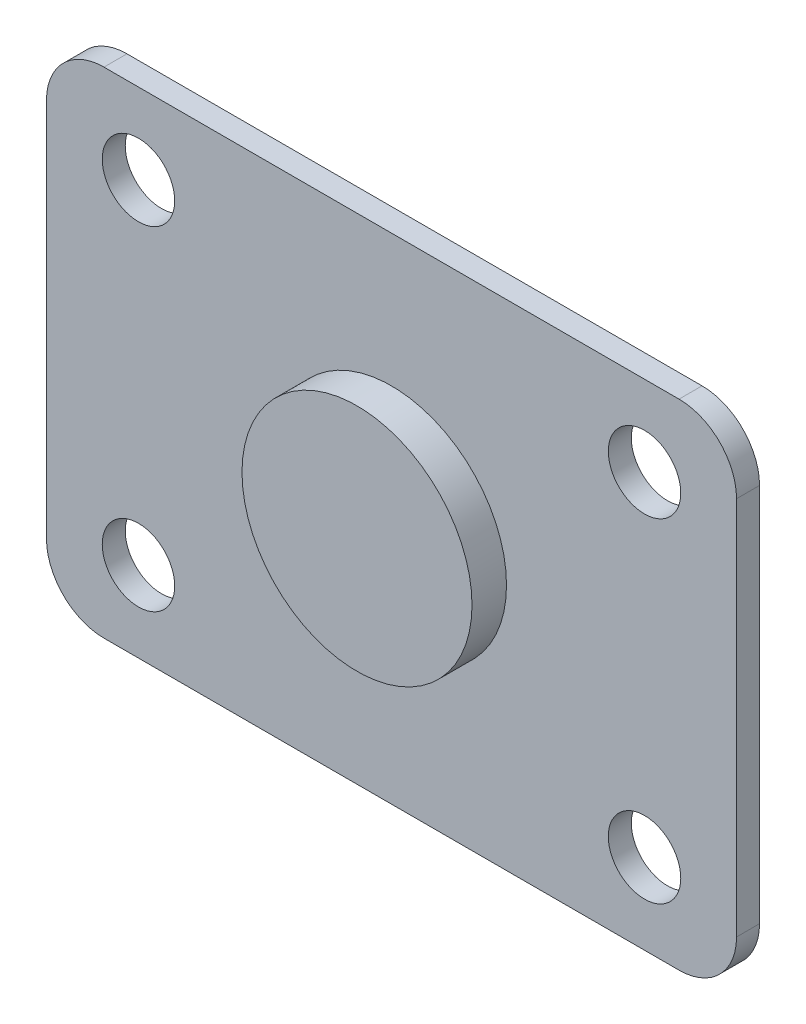
ISO-10303-21;
HEADER;
FILE_DESCRIPTION(('STEP AP214'),'2;1');
FILE_NAME('part.step','',(''),(''),'','','');
FILE_SCHEMA(('AUTOMOTIVE_DESIGN { 1 0 10303 214 1 1 1 1 }'));
ENDSEC;
DATA;
#1=APPLICATION_CONTEXT('core data for automotive mechanical design processes');
#2=APPLICATION_PROTOCOL_DEFINITION('international standard','automotive_design',2000,#1);
#3=PRODUCT_CONTEXT('',#1,'mechanical');
#4=PRODUCT('Part','Part','',(#3));
#5=PRODUCT_RELATED_PRODUCT_CATEGORY('part','',(#4));
#6=PRODUCT_DEFINITION_FORMATION('','',#4);
#7=PRODUCT_DEFINITION_CONTEXT('part definition',#1,'design');
#8=PRODUCT_DEFINITION('design','',#6,#7);
#9=PRODUCT_DEFINITION_SHAPE('','',#8);
#10=(LENGTH_UNIT() NAMED_UNIT(*) SI_UNIT(.MILLI.,.METRE.));
#11=(NAMED_UNIT(*) PLANE_ANGLE_UNIT() SI_UNIT($,.RADIAN.));
#12=(NAMED_UNIT(*) SI_UNIT($,.STERADIAN.) SOLID_ANGLE_UNIT());
#13=UNCERTAINTY_MEASURE_WITH_UNIT(LENGTH_MEASURE(1.E-05),#10,'distance_accuracy_value','');
#14=(GEOMETRIC_REPRESENTATION_CONTEXT(3) GLOBAL_UNCERTAINTY_ASSIGNED_CONTEXT((#13)) GLOBAL_UNIT_ASSIGNED_CONTEXT((#10,
#11,#12)) REPRESENTATION_CONTEXT('',''));
#15=CARTESIAN_POINT('',(0.,0.,0.));
#16=DIRECTION('',(0.,0.,1.));
#17=DIRECTION('',(1.,0.,0.));
#18=AXIS2_PLACEMENT_3D('',#15,#16,#17);
#19=CARTESIAN_POINT('',(-30.,21.5,2.));
#20=DIRECTION('',(1.,0.,0.));
#21=DIRECTION('',(0.,1.,0.));
#22=AXIS2_PLACEMENT_3D('',#19,#20,#21);
#23=PLANE('',#22);
#24=DIRECTION('',(0.,-1.,0.));
#25=VECTOR('',#24,1.);
#26=CARTESIAN_POINT('',(-30.,21.5,0.));
#27=LINE('',#26,#25);
#28=CARTESIAN_POINT('',(-30.,16.5,0.));
#29=VERTEX_POINT('',#28);
#30=CARTESIAN_POINT('',(-30.,-16.5,0.));
#31=VERTEX_POINT('',#30);
#32=EDGE_CURVE('E130',#29,#31,#27,.T.);
#33=ORIENTED_EDGE('',*,*,#32,.T.);
#34=DIRECTION('',(0.,0.,-1.));
#35=VECTOR('',#34,1.);
#36=CARTESIAN_POINT('',(-30.,-16.5,2.));
#37=LINE('',#36,#35);
#38=CARTESIAN_POINT('',(-30.,-16.5,2.));
#39=VERTEX_POINT('',#38);
#40=EDGE_CURVE('E107',#31,#39,#37,.F.);
#41=ORIENTED_EDGE('',*,*,#40,.T.);
#42=DIRECTION('',(0.,-1.,0.));
#43=VECTOR('',#42,1.);
#44=CARTESIAN_POINT('',(-30.,21.5,2.));
#45=LINE('',#44,#43);
#46=CARTESIAN_POINT('',(-30.,16.5,2.));
#47=VERTEX_POINT('',#46);
#48=EDGE_CURVE('E140',#47,#39,#45,.T.);
#49=ORIENTED_EDGE('',*,*,#48,.F.);
#50=DIRECTION('',(0.,0.,-1.));
#51=VECTOR('',#50,1.);
#52=CARTESIAN_POINT('',(-30.,16.5,2.));
#53=LINE('',#52,#51);
#54=EDGE_CURVE('E112',#47,#29,#53,.T.);
#55=ORIENTED_EDGE('',*,*,#54,.T.);
#56=EDGE_LOOP('',(#33,#41,#49,#55));
#57=FACE_BOUND('',#56,.T.);
#58=ADVANCED_FACE('F35',(#57),#23,.F.);
#59=CARTESIAN_POINT('',(-30.,-21.5,2.));
#60=DIRECTION('',(0.,1.,0.));
#61=DIRECTION('',(0.,0.,1.));
#62=AXIS2_PLACEMENT_3D('',#59,#60,#61);
#63=PLANE('',#62);
#64=DIRECTION('',(1.,0.,0.));
#65=VECTOR('',#64,1.);
#66=CARTESIAN_POINT('',(-30.,-21.5,2.));
#67=LINE('',#66,#65);
#68=CARTESIAN_POINT('',(-25.,-21.5,2.));
#69=VERTEX_POINT('',#68);
#70=CARTESIAN_POINT('',(25.,-21.5,2.));
#71=VERTEX_POINT('',#70);
#72=EDGE_CURVE('E122',#69,#71,#67,.T.);
#73=ORIENTED_EDGE('',*,*,#72,.F.);
#74=DIRECTION('',(0.,0.,-1.));
#75=VECTOR('',#74,1.);
#76=CARTESIAN_POINT('',(-25.,-21.5,2.));
#77=LINE('',#76,#75);
#78=CARTESIAN_POINT('',(-25.,-21.5,0.));
#79=VERTEX_POINT('',#78);
#80=EDGE_CURVE('E106',#69,#79,#77,.T.);
#81=ORIENTED_EDGE('',*,*,#80,.T.);
#82=DIRECTION('',(1.,0.,0.));
#83=VECTOR('',#82,1.);
#84=CARTESIAN_POINT('',(-30.,-21.5,0.));
#85=LINE('',#84,#83);
#86=CARTESIAN_POINT('',(25.,-21.5,0.));
#87=VERTEX_POINT('',#86);
#88=EDGE_CURVE('E119',#79,#87,#85,.T.);
#89=ORIENTED_EDGE('',*,*,#88,.T.);
#90=DIRECTION('',(0.,0.,-1.));
#91=VECTOR('',#90,1.);
#92=CARTESIAN_POINT('',(25.,-21.5,2.));
#93=LINE('',#92,#91);
#94=EDGE_CURVE('E124',#87,#71,#93,.F.);
#95=ORIENTED_EDGE('',*,*,#94,.T.);
#96=EDGE_LOOP('',(#73,#81,#89,#95));
#97=FACE_BOUND('',#96,.T.);
#98=ADVANCED_FACE('F118',(#97),#63,.F.);
#99=CARTESIAN_POINT('',(30.,21.5,2.));
#100=DIRECTION('',(-1.,0.,0.));
#101=DIRECTION('',(0.,-1.,0.));
#102=AXIS2_PLACEMENT_3D('',#99,#100,#101);
#103=PLANE('',#102);
#104=DIRECTION('',(0.,1.,0.));
#105=VECTOR('',#104,1.);
#106=CARTESIAN_POINT('',(30.,21.5,2.));
#107=LINE('',#106,#105);
#108=CARTESIAN_POINT('',(30.,-16.5,2.));
#109=VERTEX_POINT('',#108);
#110=CARTESIAN_POINT('',(30.,16.5,2.));
#111=VERTEX_POINT('',#110);
#112=EDGE_CURVE('E163',#109,#111,#107,.T.);
#113=ORIENTED_EDGE('',*,*,#112,.F.);
#114=DIRECTION('',(0.,0.,-1.));
#115=VECTOR('',#114,1.);
#116=CARTESIAN_POINT('',(30.,-16.5,2.));
#117=LINE('',#116,#115);
#118=CARTESIAN_POINT('',(30.,-16.5,0.));
#119=VERTEX_POINT('',#118);
#120=EDGE_CURVE('E11',#109,#119,#117,.T.);
#121=ORIENTED_EDGE('',*,*,#120,.T.);
#122=DIRECTION('',(0.,1.,0.));
#123=VECTOR('',#122,1.);
#124=CARTESIAN_POINT('',(30.,21.5,0.));
#125=LINE('',#124,#123);
#126=CARTESIAN_POINT('',(30.,16.5,0.));
#127=VERTEX_POINT('',#126);
#128=EDGE_CURVE('E129',#119,#127,#125,.T.);
#129=ORIENTED_EDGE('',*,*,#128,.T.);
#130=DIRECTION('',(0.,0.,-1.));
#131=VECTOR('',#130,1.);
#132=CARTESIAN_POINT('',(30.,16.5,2.));
#133=LINE('',#132,#131);
#134=EDGE_CURVE('E43',#127,#111,#133,.F.);
#135=ORIENTED_EDGE('',*,*,#134,.T.);
#136=EDGE_LOOP('',(#113,#121,#129,#135));
#137=FACE_BOUND('',#136,.T.);
#138=ADVANCED_FACE('F162',(#137),#103,.F.);
#139=CARTESIAN_POINT('',(-30.,21.5,2.));
#140=DIRECTION('',(0.,-1.,0.));
#141=DIRECTION('',(0.,0.,-1.));
#142=AXIS2_PLACEMENT_3D('',#139,#140,#141);
#143=PLANE('',#142);
#144=DIRECTION('',(-1.,0.,0.));
#145=VECTOR('',#144,1.);
#146=CARTESIAN_POINT('',(-30.,21.5,0.));
#147=LINE('',#146,#145);
#148=CARTESIAN_POINT('',(25.,21.5,0.));
#149=VERTEX_POINT('',#148);
#150=CARTESIAN_POINT('',(-25.,21.5,0.));
#151=VERTEX_POINT('',#150);
#152=EDGE_CURVE('E133',#149,#151,#147,.T.);
#153=ORIENTED_EDGE('',*,*,#152,.T.);
#154=DIRECTION('',(0.,0.,-1.));
#155=VECTOR('',#154,1.);
#156=CARTESIAN_POINT('',(-25.,21.5,2.));
#157=LINE('',#156,#155);
#158=CARTESIAN_POINT('',(-25.,21.5,2.));
#159=VERTEX_POINT('',#158);
#160=EDGE_CURVE('E50',#151,#159,#157,.F.);
#161=ORIENTED_EDGE('',*,*,#160,.T.);
#162=DIRECTION('',(-1.,0.,0.));
#163=VECTOR('',#162,1.);
#164=CARTESIAN_POINT('',(-30.,21.5,2.));
#165=LINE('',#164,#163);
#166=CARTESIAN_POINT('',(25.,21.5,2.));
#167=VERTEX_POINT('',#166);
#168=EDGE_CURVE('E169',#167,#159,#165,.T.);
#169=ORIENTED_EDGE('',*,*,#168,.F.);
#170=DIRECTION('',(0.,0.,-1.));
#171=VECTOR('',#170,1.);
#172=CARTESIAN_POINT('',(25.,21.5,2.));
#173=LINE('',#172,#171);
#174=EDGE_CURVE('E156',#167,#149,#173,.T.);
#175=ORIENTED_EDGE('',*,*,#174,.T.);
#176=EDGE_LOOP('',(#153,#161,#169,#175));
#177=FACE_BOUND('',#176,.T.);
#178=ADVANCED_FACE('F173',(#177),#143,.F.);
#179=CARTESIAN_POINT('',(0.,0.,2.));
#180=DIRECTION('',(0.,0.,1.));
#181=DIRECTION('',(1.,0.,0.));
#182=AXIS2_PLACEMENT_3D('',#179,#180,#181);
#183=PLANE('',#182);
#184=CARTESIAN_POINT('',(-22.,-14.5,2.));
#185=DIRECTION('',(0.,0.,1.));
#186=DIRECTION('',(1.,0.,0.));
#187=AXIS2_PLACEMENT_3D('',#184,#185,#186);
#188=CIRCLE('',#187,3.15);
#189=CARTESIAN_POINT('',(-18.85,-14.5,2.));
#190=VERTEX_POINT('',#189);
#191=EDGE_CURVE('E246',#190,#190,#188,.T.);
#192=ORIENTED_EDGE('',*,*,#191,.F.);
#193=EDGE_LOOP('',(#192));
#194=FACE_BOUND('',#193,.T.);
#195=CARTESIAN_POINT('',(22.,14.5,2.));
#196=DIRECTION('',(0.,0.,1.));
#197=DIRECTION('',(1.,0.,0.));
#198=AXIS2_PLACEMENT_3D('',#195,#196,#197);
#199=CIRCLE('',#198,3.15);
#200=CARTESIAN_POINT('',(25.15,14.5,2.));
#201=VERTEX_POINT('',#200);
#202=EDGE_CURVE('E248',#201,#201,#199,.T.);
#203=ORIENTED_EDGE('',*,*,#202,.F.);
#204=EDGE_LOOP('',(#203));
#205=FACE_BOUND('',#204,.T.);
#206=CARTESIAN_POINT('',(22.,-14.5,2.));
#207=DIRECTION('',(0.,0.,1.));
#208=DIRECTION('',(1.,0.,0.));
#209=AXIS2_PLACEMENT_3D('',#206,#207,#208);
#210=CIRCLE('',#209,3.15);
#211=CARTESIAN_POINT('',(25.15,-14.5,2.));
#212=VERTEX_POINT('',#211);
#213=EDGE_CURVE('E253',#212,#212,#210,.T.);
#214=ORIENTED_EDGE('',*,*,#213,.F.);
#215=EDGE_LOOP('',(#214));
#216=FACE_BOUND('',#215,.T.);
#217=CARTESIAN_POINT('',(-22.,14.5,2.));
#218=DIRECTION('',(0.,0.,1.));
#219=DIRECTION('',(1.,0.,0.));
#220=AXIS2_PLACEMENT_3D('',#217,#218,#219);
#221=CIRCLE('',#220,3.15);
#222=CARTESIAN_POINT('',(-18.85,14.5,2.));
#223=VERTEX_POINT('',#222);
#224=EDGE_CURVE('E256',#223,#223,#221,.T.);
#225=ORIENTED_EDGE('',*,*,#224,.F.);
#226=EDGE_LOOP('',(#225));
#227=FACE_BOUND('',#226,.T.);
#228=CARTESIAN_POINT('',(0.,0.,2.));
#229=DIRECTION('',(0.,0.,1.));
#230=DIRECTION('',(1.,0.,0.));
#231=AXIS2_PLACEMENT_3D('',#228,#229,#230);
#232=CIRCLE('',#231,10.);
#233=CARTESIAN_POINT('',(10.,0.,2.));
#234=VERTEX_POINT('',#233);
#235=EDGE_CURVE('E141',#234,#234,#232,.T.);
#236=ORIENTED_EDGE('',*,*,#235,.F.);
#237=EDGE_LOOP('',(#236));
#238=FACE_BOUND('',#237,.T.);
#239=ORIENTED_EDGE('',*,*,#48,.T.);
#240=CARTESIAN_POINT('',(-25.,-16.5,2.));
#241=DIRECTION('',(0.,0.,1.));
#242=DIRECTION('',(1.,0.,0.));
#243=AXIS2_PLACEMENT_3D('',#240,#241,#242);
#244=CIRCLE('',#243,5.);
#245=EDGE_CURVE('E154',#39,#69,#244,.T.);
#246=ORIENTED_EDGE('',*,*,#245,.T.);
#247=ORIENTED_EDGE('',*,*,#72,.T.);
#248=CARTESIAN_POINT('',(25.,-16.5,2.));
#249=DIRECTION('',(0.,0.,1.));
#250=DIRECTION('',(1.,0.,0.));
#251=AXIS2_PLACEMENT_3D('',#248,#249,#250);
#252=CIRCLE('',#251,5.);
#253=EDGE_CURVE('E150',#71,#109,#252,.T.);
#254=ORIENTED_EDGE('',*,*,#253,.T.);
#255=ORIENTED_EDGE('',*,*,#112,.T.);
#256=CARTESIAN_POINT('',(25.,16.5,2.));
#257=DIRECTION('',(0.,0.,1.));
#258=DIRECTION('',(1.,0.,0.));
#259=AXIS2_PLACEMENT_3D('',#256,#257,#258);
#260=CIRCLE('',#259,5.);
#261=EDGE_CURVE('E57',#111,#167,#260,.T.);
#262=ORIENTED_EDGE('',*,*,#261,.T.);
#263=ORIENTED_EDGE('',*,*,#168,.T.);
#264=CARTESIAN_POINT('',(-25.,16.5,2.));
#265=DIRECTION('',(0.,0.,1.));
#266=DIRECTION('',(1.,0.,0.));
#267=AXIS2_PLACEMENT_3D('',#264,#265,#266);
#268=CIRCLE('',#267,5.);
#269=EDGE_CURVE('E152',#159,#47,#268,.T.);
#270=ORIENTED_EDGE('',*,*,#269,.T.);
#271=EDGE_LOOP('',(#239,#246,#247,#254,#255,#262,#263,#270));
#272=FACE_BOUND('',#271,.T.);
#273=ADVANCED_FACE('F167',(#194,#205,#216,#227,#238,#272),#183,.T.);
#274=CARTESIAN_POINT('',(0.,0.,0.));
#275=DIRECTION('',(0.,0.,1.));
#276=DIRECTION('',(1.,0.,0.));
#277=AXIS2_PLACEMENT_3D('',#274,#275,#276);
#278=PLANE('',#277);
#279=CARTESIAN_POINT('',(-22.,-14.5,0.));
#280=DIRECTION('',(0.,0.,-1.));
#281=DIRECTION('',(-1.,0.,0.));
#282=AXIS2_PLACEMENT_3D('',#279,#280,#281);
#283=CIRCLE('',#282,3.15);
#284=CARTESIAN_POINT('',(-25.15,-14.5,0.));
#285=VERTEX_POINT('',#284);
#286=EDGE_CURVE('E261',#285,#285,#283,.T.);
#287=ORIENTED_EDGE('',*,*,#286,.F.);
#288=EDGE_LOOP('',(#287));
#289=FACE_BOUND('',#288,.T.);
#290=CARTESIAN_POINT('',(22.,14.5,0.));
#291=DIRECTION('',(0.,0.,-1.));
#292=DIRECTION('',(-1.,0.,0.));
#293=AXIS2_PLACEMENT_3D('',#290,#291,#292);
#294=CIRCLE('',#293,3.15);
#295=CARTESIAN_POINT('',(18.85,14.5,0.));
#296=VERTEX_POINT('',#295);
#297=EDGE_CURVE('E262',#296,#296,#294,.T.);
#298=ORIENTED_EDGE('',*,*,#297,.F.);
#299=EDGE_LOOP('',(#298));
#300=FACE_BOUND('',#299,.T.);
#301=CARTESIAN_POINT('',(22.,-14.5,0.));
#302=DIRECTION('',(0.,0.,-1.));
#303=DIRECTION('',(-1.,0.,0.));
#304=AXIS2_PLACEMENT_3D('',#301,#302,#303);
#305=CIRCLE('',#304,3.15);
#306=CARTESIAN_POINT('',(18.85,-14.5,0.));
#307=VERTEX_POINT('',#306);
#308=EDGE_CURVE('E265',#307,#307,#305,.T.);
#309=ORIENTED_EDGE('',*,*,#308,.F.);
#310=EDGE_LOOP('',(#309));
#311=FACE_BOUND('',#310,.T.);
#312=CARTESIAN_POINT('',(-22.,14.5,0.));
#313=DIRECTION('',(0.,0.,-1.));
#314=DIRECTION('',(-1.,0.,0.));
#315=AXIS2_PLACEMENT_3D('',#312,#313,#314);
#316=CIRCLE('',#315,3.15);
#317=CARTESIAN_POINT('',(-25.15,14.5,0.));
#318=VERTEX_POINT('',#317);
#319=EDGE_CURVE('E258',#318,#318,#316,.T.);
#320=ORIENTED_EDGE('',*,*,#319,.F.);
#321=EDGE_LOOP('',(#320));
#322=FACE_BOUND('',#321,.T.);
#323=ORIENTED_EDGE('',*,*,#88,.F.);
#324=CARTESIAN_POINT('',(-25.,-16.5,0.));
#325=DIRECTION('',(0.,0.,1.));
#326=DIRECTION('',(1.,0.,0.));
#327=AXIS2_PLACEMENT_3D('',#324,#325,#326);
#328=CIRCLE('',#327,5.);
#329=EDGE_CURVE('E102',#79,#31,#328,.F.);
#330=ORIENTED_EDGE('',*,*,#329,.T.);
#331=ORIENTED_EDGE('',*,*,#32,.F.);
#332=CARTESIAN_POINT('',(-25.,16.5,0.));
#333=DIRECTION('',(0.,0.,1.));
#334=DIRECTION('',(1.,0.,0.));
#335=AXIS2_PLACEMENT_3D('',#332,#333,#334);
#336=CIRCLE('',#335,5.);
#337=EDGE_CURVE('E113',#29,#151,#336,.F.);
#338=ORIENTED_EDGE('',*,*,#337,.T.);
#339=ORIENTED_EDGE('',*,*,#152,.F.);
#340=CARTESIAN_POINT('',(25.,16.5,0.));
#341=DIRECTION('',(0.,0.,1.));
#342=DIRECTION('',(1.,0.,0.));
#343=AXIS2_PLACEMENT_3D('',#340,#341,#342);
#344=CIRCLE('',#343,5.);
#345=EDGE_CURVE('E123',#149,#127,#344,.F.);
#346=ORIENTED_EDGE('',*,*,#345,.T.);
#347=ORIENTED_EDGE('',*,*,#128,.F.);
#348=CARTESIAN_POINT('',(25.,-16.5,0.));
#349=DIRECTION('',(0.,0.,1.));
#350=DIRECTION('',(1.,0.,0.));
#351=AXIS2_PLACEMENT_3D('',#348,#349,#350);
#352=CIRCLE('',#351,5.);
#353=EDGE_CURVE('E128',#119,#87,#352,.F.);
#354=ORIENTED_EDGE('',*,*,#353,.T.);
#355=EDGE_LOOP('',(#323,#330,#331,#338,#339,#346,#347,#354));
#356=FACE_BOUND('',#355,.T.);
#357=ADVANCED_FACE('F126',(#289,#300,#311,#322,#356),#278,.F.);
#358=CARTESIAN_POINT('',(0.,0.,5.));
#359=DIRECTION('',(0.,0.,-1.));
#360=DIRECTION('',(-1.,0.,0.));
#361=AXIS2_PLACEMENT_3D('',#358,#359,#360);
#362=CYLINDRICAL_SURFACE('',#361,10.);
#363=CARTESIAN_POINT('',(0.,0.,5.));
#364=DIRECTION('',(0.,0.,1.));
#365=DIRECTION('',(1.,0.,0.));
#366=AXIS2_PLACEMENT_3D('',#363,#364,#365);
#367=CIRCLE('',#366,10.);
#368=CARTESIAN_POINT('',(10.,0.,5.));
#369=VERTEX_POINT('',#368);
#370=EDGE_CURVE('E135',#369,#369,#367,.T.);
#371=ORIENTED_EDGE('',*,*,#370,.F.);
#372=EDGE_LOOP('',(#371));
#373=FACE_BOUND('',#372,.T.);
#374=ORIENTED_EDGE('',*,*,#235,.T.);
#375=EDGE_LOOP('',(#374));
#376=FACE_BOUND('',#375,.T.);
#377=ADVANCED_FACE('F187',(#373,#376),#362,.T.);
#378=CARTESIAN_POINT('',(0.,0.,5.));
#379=DIRECTION('',(0.,0.,1.));
#380=DIRECTION('',(1.,0.,0.));
#381=AXIS2_PLACEMENT_3D('',#378,#379,#380);
#382=PLANE('',#381);
#383=ORIENTED_EDGE('',*,*,#370,.T.);
#384=EDGE_LOOP('',(#383));
#385=FACE_BOUND('',#384,.T.);
#386=ADVANCED_FACE('F212',(#385),#382,.T.);
#387=CARTESIAN_POINT('',(-25.,-16.5,2.));
#388=DIRECTION('',(0.,0.,-1.));
#389=DIRECTION('',(-1.,0.,0.));
#390=AXIS2_PLACEMENT_3D('',#387,#388,#389);
#391=CYLINDRICAL_SURFACE('',#390,5.);
#392=ORIENTED_EDGE('',*,*,#245,.F.);
#393=ORIENTED_EDGE('',*,*,#40,.F.);
#394=ORIENTED_EDGE('',*,*,#329,.F.);
#395=ORIENTED_EDGE('',*,*,#80,.F.);
#396=EDGE_LOOP('',(#392,#393,#394,#395));
#397=FACE_BOUND('',#396,.T.);
#398=ADVANCED_FACE('F105',(#397),#391,.T.);
#399=CARTESIAN_POINT('',(-25.,16.5,2.));
#400=DIRECTION('',(0.,0.,-1.));
#401=DIRECTION('',(-1.,0.,0.));
#402=AXIS2_PLACEMENT_3D('',#399,#400,#401);
#403=CYLINDRICAL_SURFACE('',#402,5.);
#404=ORIENTED_EDGE('',*,*,#269,.F.);
#405=ORIENTED_EDGE('',*,*,#160,.F.);
#406=ORIENTED_EDGE('',*,*,#337,.F.);
#407=ORIENTED_EDGE('',*,*,#54,.F.);
#408=EDGE_LOOP('',(#404,#405,#406,#407));
#409=FACE_BOUND('',#408,.T.);
#410=ADVANCED_FACE('F177',(#409),#403,.T.);
#411=CARTESIAN_POINT('',(25.,-16.5,2.));
#412=DIRECTION('',(0.,0.,-1.));
#413=DIRECTION('',(-1.,0.,0.));
#414=AXIS2_PLACEMENT_3D('',#411,#412,#413);
#415=CYLINDRICAL_SURFACE('',#414,5.);
#416=ORIENTED_EDGE('',*,*,#253,.F.);
#417=ORIENTED_EDGE('',*,*,#94,.F.);
#418=ORIENTED_EDGE('',*,*,#353,.F.);
#419=ORIENTED_EDGE('',*,*,#120,.F.);
#420=EDGE_LOOP('',(#416,#417,#418,#419));
#421=FACE_BOUND('',#420,.T.);
#422=ADVANCED_FACE('F214',(#421),#415,.T.);
#423=CARTESIAN_POINT('',(25.,16.5,2.));
#424=DIRECTION('',(0.,0.,-1.));
#425=DIRECTION('',(-1.,0.,0.));
#426=AXIS2_PLACEMENT_3D('',#423,#424,#425);
#427=CYLINDRICAL_SURFACE('',#426,5.);
#428=ORIENTED_EDGE('',*,*,#261,.F.);
#429=ORIENTED_EDGE('',*,*,#134,.F.);
#430=ORIENTED_EDGE('',*,*,#345,.F.);
#431=ORIENTED_EDGE('',*,*,#174,.F.);
#432=EDGE_LOOP('',(#428,#429,#430,#431));
#433=FACE_BOUND('',#432,.T.);
#434=ADVANCED_FACE('F37',(#433),#427,.T.);
#435=CARTESIAN_POINT('',(-22.,14.5,3.));
#436=DIRECTION('',(0.,0.,-1.));
#437=DIRECTION('',(-1.,0.,0.));
#438=AXIS2_PLACEMENT_3D('',#435,#436,#437);
#439=CYLINDRICAL_SURFACE('',#438,3.15);
#440=ORIENTED_EDGE('',*,*,#224,.T.);
#441=EDGE_LOOP('',(#440));
#442=FACE_BOUND('',#441,.T.);
#443=ORIENTED_EDGE('',*,*,#319,.T.);
#444=EDGE_LOOP('',(#443));
#445=FACE_BOUND('',#444,.T.);
#446=ADVANCED_FACE('F220',(#442,#445),#439,.F.);
#447=CARTESIAN_POINT('',(22.,-14.5,3.));
#448=DIRECTION('',(0.,0.,-1.));
#449=DIRECTION('',(-1.,0.,0.));
#450=AXIS2_PLACEMENT_3D('',#447,#448,#449);
#451=CYLINDRICAL_SURFACE('',#450,3.15);
#452=ORIENTED_EDGE('',*,*,#213,.T.);
#453=EDGE_LOOP('',(#452));
#454=FACE_BOUND('',#453,.T.);
#455=ORIENTED_EDGE('',*,*,#308,.T.);
#456=EDGE_LOOP('',(#455));
#457=FACE_BOUND('',#456,.T.);
#458=ADVANCED_FACE('F224',(#454,#457),#451,.F.);
#459=CARTESIAN_POINT('',(22.,14.5,3.));
#460=DIRECTION('',(0.,0.,-1.));
#461=DIRECTION('',(-1.,0.,0.));
#462=AXIS2_PLACEMENT_3D('',#459,#460,#461);
#463=CYLINDRICAL_SURFACE('',#462,3.15);
#464=ORIENTED_EDGE('',*,*,#202,.T.);
#465=EDGE_LOOP('',(#464));
#466=FACE_BOUND('',#465,.T.);
#467=ORIENTED_EDGE('',*,*,#297,.T.);
#468=EDGE_LOOP('',(#467));
#469=FACE_BOUND('',#468,.T.);
#470=ADVANCED_FACE('F230',(#466,#469),#463,.F.);
#471=CARTESIAN_POINT('',(-22.,-14.5,3.));
#472=DIRECTION('',(0.,0.,-1.));
#473=DIRECTION('',(-1.,0.,0.));
#474=AXIS2_PLACEMENT_3D('',#471,#472,#473);
#475=CYLINDRICAL_SURFACE('',#474,3.15);
#476=ORIENTED_EDGE('',*,*,#191,.T.);
#477=EDGE_LOOP('',(#476));
#478=FACE_BOUND('',#477,.T.);
#479=ORIENTED_EDGE('',*,*,#286,.T.);
#480=EDGE_LOOP('',(#479));
#481=FACE_BOUND('',#480,.T.);
#482=ADVANCED_FACE('F276',(#478,#481),#475,.F.);
#483=CLOSED_SHELL('',(#58,#98,#138,#178,#273,#357,#377,#386,#398,#410,#422,#434,#446,#458,#470,#482));
#484=MANIFOLD_SOLID_BREP('B2',#483);
#485=ADVANCED_BREP_SHAPE_REPRESENTATION('',(#18,#484),#14);
#486=SHAPE_DEFINITION_REPRESENTATION(#9,#485);
ENDSEC;
END-ISO-10303-21;
